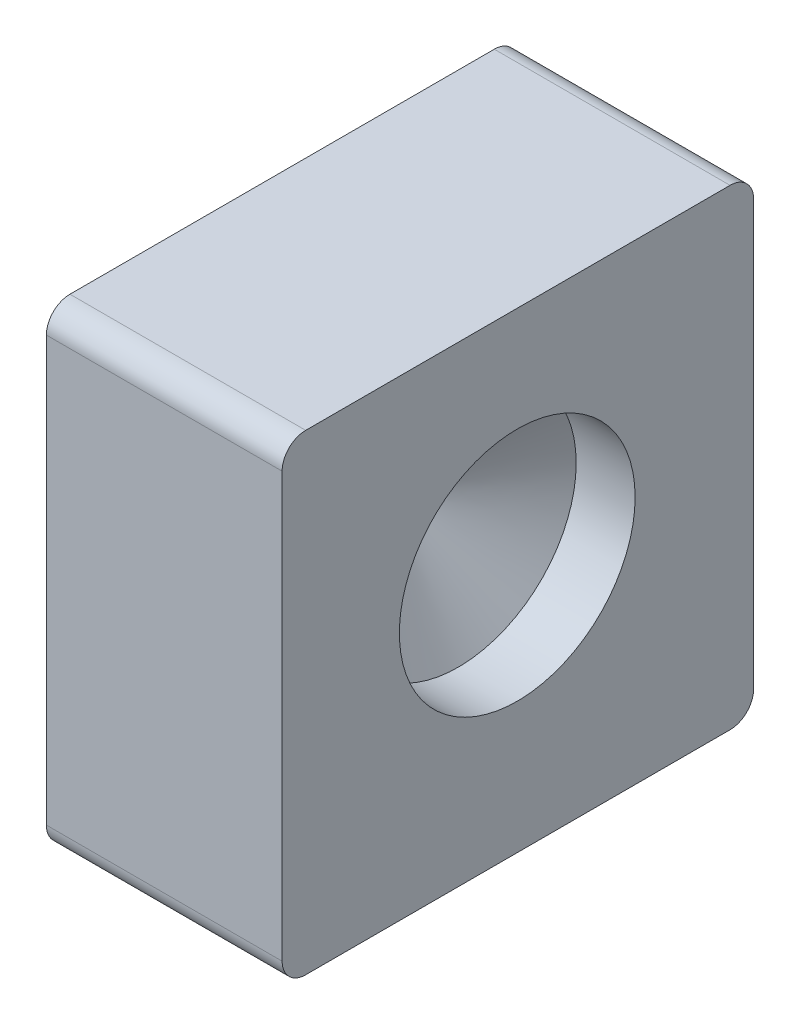
ISO-10303-21;
HEADER;
FILE_DESCRIPTION(('STEP AP214'),'2;1');
FILE_NAME('part.step','',(''),(''),'','','');
FILE_SCHEMA(('AUTOMOTIVE_DESIGN { 1 0 10303 214 1 1 1 1 }'));
ENDSEC;
DATA;
#1=APPLICATION_CONTEXT('core data for automotive mechanical design processes');
#2=APPLICATION_PROTOCOL_DEFINITION('international standard','automotive_design',2000,#1);
#3=PRODUCT_CONTEXT('',#1,'mechanical');
#4=PRODUCT('Part','Part','',(#3));
#5=PRODUCT_RELATED_PRODUCT_CATEGORY('part','',(#4));
#6=PRODUCT_DEFINITION_FORMATION('','',#4);
#7=PRODUCT_DEFINITION_CONTEXT('part definition',#1,'design');
#8=PRODUCT_DEFINITION('design','',#6,#7);
#9=PRODUCT_DEFINITION_SHAPE('','',#8);
#10=(LENGTH_UNIT() NAMED_UNIT(*) SI_UNIT(.MILLI.,.METRE.));
#11=(NAMED_UNIT(*) PLANE_ANGLE_UNIT() SI_UNIT($,.RADIAN.));
#12=(NAMED_UNIT(*) SI_UNIT($,.STERADIAN.) SOLID_ANGLE_UNIT());
#13=UNCERTAINTY_MEASURE_WITH_UNIT(LENGTH_MEASURE(1.E-05),#10,'distance_accuracy_value','');
#14=(GEOMETRIC_REPRESENTATION_CONTEXT(3) GLOBAL_UNCERTAINTY_ASSIGNED_CONTEXT((#13)) GLOBAL_UNIT_ASSIGNED_CONTEXT((#10,
#11,#12)) REPRESENTATION_CONTEXT('',''));
#15=CARTESIAN_POINT('',(0.,0.,0.));
#16=DIRECTION('',(0.,0.,1.));
#17=DIRECTION('',(1.,0.,0.));
#18=AXIS2_PLACEMENT_3D('',#15,#16,#17);
#19=CARTESIAN_POINT('',(25.4,24.2943377133913,25.2010381101445));
#20=DIRECTION('',(-1.,0.,0.));
#21=DIRECTION('',(0.,0.,1.));
#22=AXIS2_PLACEMENT_3D('',#19,#20,#21);
#23=CYLINDRICAL_SURFACE('',#22,2.54);
#24=CARTESIAN_POINT('',(0.,24.2943377133913,25.2010381101445));
#25=DIRECTION('',(1.,0.,0.));
#26=DIRECTION('',(0.,0.,-1.));
#27=AXIS2_PLACEMENT_3D('',#24,#25,#26);
#28=CIRCLE('',#27,2.54);
#29=CARTESIAN_POINT('',(0.,26.8343377133913,25.2010381101445));
#30=VERTEX_POINT('',#29);
#31=CARTESIAN_POINT('',(0.,24.2943377133913,27.7410381101445));
#32=VERTEX_POINT('',#31);
#33=EDGE_CURVE('E146',#30,#32,#28,.T.);
#34=ORIENTED_EDGE('',*,*,#33,.T.);
#35=DIRECTION('',(-1.,0.,0.));
#36=VECTOR('',#35,1.);
#37=CARTESIAN_POINT('',(25.4,24.2943377133913,27.7410381101445));
#38=LINE('',#37,#36);
#39=CARTESIAN_POINT('',(25.4,24.2943377133913,27.7410381101445));
#40=VERTEX_POINT('',#39);
#41=EDGE_CURVE('E11',#40,#32,#38,.T.);
#42=ORIENTED_EDGE('',*,*,#41,.F.);
#43=CARTESIAN_POINT('',(25.4,24.2943377133913,25.2010381101445));
#44=DIRECTION('',(1.,0.,0.));
#45=DIRECTION('',(0.,0.,-1.));
#46=AXIS2_PLACEMENT_3D('',#43,#44,#45);
#47=CIRCLE('',#46,2.54);
#48=CARTESIAN_POINT('',(25.4,26.8343377133913,25.2010381101445));
#49=VERTEX_POINT('',#48);
#50=EDGE_CURVE('E169',#49,#40,#47,.T.);
#51=ORIENTED_EDGE('',*,*,#50,.F.);
#52=DIRECTION('',(-1.,0.,0.));
#53=VECTOR('',#52,1.);
#54=CARTESIAN_POINT('',(25.4,26.8343377133913,25.2010381101445));
#55=LINE('',#54,#53);
#56=EDGE_CURVE('E142',#49,#30,#55,.T.);
#57=ORIENTED_EDGE('',*,*,#56,.T.);
#58=EDGE_LOOP('',(#34,#42,#51,#57));
#59=FACE_BOUND('',#58,.T.);
#60=ADVANCED_FACE('F43',(#59),#23,.T.);
#61=CARTESIAN_POINT('',(25.4,-21.4256622866086,27.7410381101445));
#62=DIRECTION('',(0.,0.,-1.));
#63=DIRECTION('',(0.,1.,0.));
#64=AXIS2_PLACEMENT_3D('',#61,#62,#63);
#65=PLANE('',#64);
#66=DIRECTION('',(0.,-1.,0.));
#67=VECTOR('',#66,1.);
#68=CARTESIAN_POINT('',(0.,-21.4256622866086,27.7410381101445));
#69=LINE('',#68,#67);
#70=CARTESIAN_POINT('',(0.,-21.4256622866087,27.7410381101445));
#71=VERTEX_POINT('',#70);
#72=EDGE_CURVE('E150',#32,#71,#69,.T.);
#73=ORIENTED_EDGE('',*,*,#72,.T.);
#74=DIRECTION('',(-1.,0.,0.));
#75=VECTOR('',#74,1.);
#76=CARTESIAN_POINT('',(25.4,-21.4256622866087,27.7410381101445));
#77=LINE('',#76,#75);
#78=CARTESIAN_POINT('',(25.4,-21.4256622866087,27.7410381101445));
#79=VERTEX_POINT('',#78);
#80=EDGE_CURVE('E52',#79,#71,#77,.T.);
#81=ORIENTED_EDGE('',*,*,#80,.F.);
#82=DIRECTION('',(0.,-1.,0.));
#83=VECTOR('',#82,1.);
#84=CARTESIAN_POINT('',(25.4,-21.4256622866086,27.7410381101445));
#85=LINE('',#84,#83);
#86=EDGE_CURVE('E104',#40,#79,#85,.T.);
#87=ORIENTED_EDGE('',*,*,#86,.F.);
#88=ORIENTED_EDGE('',*,*,#41,.T.);
#89=EDGE_LOOP('',(#73,#81,#87,#88));
#90=FACE_BOUND('',#89,.T.);
#91=ADVANCED_FACE('F235',(#90),#65,.F.);
#92=CARTESIAN_POINT('',(25.4,-21.4256622866087,25.2010381101445));
#93=DIRECTION('',(-1.,0.,0.));
#94=DIRECTION('',(0.,0.,1.));
#95=AXIS2_PLACEMENT_3D('',#92,#93,#94);
#96=CYLINDRICAL_SURFACE('',#95,2.54);
#97=CARTESIAN_POINT('',(0.,-21.4256622866087,25.2010381101445));
#98=DIRECTION('',(1.,0.,0.));
#99=DIRECTION('',(0.,0.,1.));
#100=AXIS2_PLACEMENT_3D('',#97,#98,#99);
#101=CIRCLE('',#100,2.54);
#102=CARTESIAN_POINT('',(0.,-23.9656622866087,25.2010381101445));
#103=VERTEX_POINT('',#102);
#104=EDGE_CURVE('E154',#71,#103,#101,.T.);
#105=ORIENTED_EDGE('',*,*,#104,.T.);
#106=DIRECTION('',(-1.,0.,0.));
#107=VECTOR('',#106,1.);
#108=CARTESIAN_POINT('',(25.4,-23.9656622866087,25.2010381101445));
#109=LINE('',#108,#107);
#110=CARTESIAN_POINT('',(25.4,-23.9656622866087,25.2010381101445));
#111=VERTEX_POINT('',#110);
#112=EDGE_CURVE('E180',#111,#103,#109,.T.);
#113=ORIENTED_EDGE('',*,*,#112,.F.);
#114=CARTESIAN_POINT('',(25.4,-21.4256622866087,25.2010381101445));
#115=DIRECTION('',(1.,0.,0.));
#116=DIRECTION('',(0.,0.,1.));
#117=AXIS2_PLACEMENT_3D('',#114,#115,#116);
#118=CIRCLE('',#117,2.54);
#119=EDGE_CURVE('E190',#79,#111,#118,.T.);
#120=ORIENTED_EDGE('',*,*,#119,.F.);
#121=ORIENTED_EDGE('',*,*,#80,.T.);
#122=EDGE_LOOP('',(#105,#113,#120,#121));
#123=FACE_BOUND('',#122,.T.);
#124=ADVANCED_FACE('F188',(#123),#96,.T.);
#125=CARTESIAN_POINT('',(25.4,-23.9656622866087,-20.5189618898555));
#126=DIRECTION('',(0.,1.,0.));
#127=DIRECTION('',(0.,0.,1.));
#128=AXIS2_PLACEMENT_3D('',#125,#126,#127);
#129=PLANE('',#128);
#130=DIRECTION('',(0.,0.,-1.));
#131=VECTOR('',#130,1.);
#132=CARTESIAN_POINT('',(0.,-23.9656622866087,-20.5189618898555));
#133=LINE('',#132,#131);
#134=CARTESIAN_POINT('',(0.,-23.9656622866087,-20.5189618898555));
#135=VERTEX_POINT('',#134);
#136=EDGE_CURVE('E157',#103,#135,#133,.T.);
#137=ORIENTED_EDGE('',*,*,#136,.T.);
#138=DIRECTION('',(-1.,0.,0.));
#139=VECTOR('',#138,1.);
#140=CARTESIAN_POINT('',(25.4,-23.9656622866087,-20.5189618898555));
#141=LINE('',#140,#139);
#142=CARTESIAN_POINT('',(25.4,-23.9656622866087,-20.5189618898555));
#143=VERTEX_POINT('',#142);
#144=EDGE_CURVE('E176',#143,#135,#141,.T.);
#145=ORIENTED_EDGE('',*,*,#144,.F.);
#146=DIRECTION('',(0.,0.,-1.));
#147=VECTOR('',#146,1.);
#148=CARTESIAN_POINT('',(25.4,-23.9656622866087,-20.5189618898555));
#149=LINE('',#148,#147);
#150=EDGE_CURVE('E203',#111,#143,#149,.T.);
#151=ORIENTED_EDGE('',*,*,#150,.F.);
#152=ORIENTED_EDGE('',*,*,#112,.T.);
#153=EDGE_LOOP('',(#137,#145,#151,#152));
#154=FACE_BOUND('',#153,.T.);
#155=ADVANCED_FACE('F198',(#154),#129,.F.);
#156=CARTESIAN_POINT('',(25.4,-21.4256622866087,-20.5189618898555));
#157=DIRECTION('',(-1.,0.,0.));
#158=DIRECTION('',(0.,0.,1.));
#159=AXIS2_PLACEMENT_3D('',#156,#157,#158);
#160=CYLINDRICAL_SURFACE('',#159,2.54);
#161=CARTESIAN_POINT('',(0.,-21.4256622866087,-20.5189618898555));
#162=DIRECTION('',(1.,0.,0.));
#163=DIRECTION('',(0.,0.,1.));
#164=AXIS2_PLACEMENT_3D('',#161,#162,#163);
#165=CIRCLE('',#164,2.54);
#166=CARTESIAN_POINT('',(0.,-21.4256622866086,-23.0589618898555));
#167=VERTEX_POINT('',#166);
#168=EDGE_CURVE('E160',#135,#167,#165,.T.);
#169=ORIENTED_EDGE('',*,*,#168,.T.);
#170=DIRECTION('',(-1.,0.,0.));
#171=VECTOR('',#170,1.);
#172=CARTESIAN_POINT('',(25.4,-21.4256622866086,-23.0589618898555));
#173=LINE('',#172,#171);
#174=CARTESIAN_POINT('',(25.4,-21.4256622866086,-23.0589618898555));
#175=VERTEX_POINT('',#174);
#176=EDGE_CURVE('E135',#175,#167,#173,.T.);
#177=ORIENTED_EDGE('',*,*,#176,.F.);
#178=CARTESIAN_POINT('',(25.4,-21.4256622866087,-20.5189618898555));
#179=DIRECTION('',(1.,0.,0.));
#180=DIRECTION('',(0.,0.,1.));
#181=AXIS2_PLACEMENT_3D('',#178,#179,#180);
#182=CIRCLE('',#181,2.54);
#183=EDGE_CURVE('E124',#143,#175,#182,.T.);
#184=ORIENTED_EDGE('',*,*,#183,.F.);
#185=ORIENTED_EDGE('',*,*,#144,.T.);
#186=EDGE_LOOP('',(#169,#177,#184,#185));
#187=FACE_BOUND('',#186,.T.);
#188=ADVANCED_FACE('F201',(#187),#160,.T.);
#189=CARTESIAN_POINT('',(25.4,24.2943377133913,-23.0589618898555));
#190=DIRECTION('',(0.,0.,1.));
#191=DIRECTION('',(0.,-1.,0.));
#192=AXIS2_PLACEMENT_3D('',#189,#190,#191);
#193=PLANE('',#192);
#194=DIRECTION('',(0.,1.,0.));
#195=VECTOR('',#194,1.);
#196=CARTESIAN_POINT('',(0.,24.2943377133913,-23.0589618898555));
#197=LINE('',#196,#195);
#198=CARTESIAN_POINT('',(0.,24.2943377133913,-23.0589618898555));
#199=VERTEX_POINT('',#198);
#200=EDGE_CURVE('E133',#167,#199,#197,.T.);
#201=ORIENTED_EDGE('',*,*,#200,.T.);
#202=DIRECTION('',(-1.,0.,0.));
#203=VECTOR('',#202,1.);
#204=CARTESIAN_POINT('',(25.4,24.2943377133913,-23.0589618898555));
#205=LINE('',#204,#203);
#206=CARTESIAN_POINT('',(25.4,24.2943377133913,-23.0589618898555));
#207=VERTEX_POINT('',#206);
#208=EDGE_CURVE('E130',#207,#199,#205,.T.);
#209=ORIENTED_EDGE('',*,*,#208,.F.);
#210=DIRECTION('',(0.,1.,0.));
#211=VECTOR('',#210,1.);
#212=CARTESIAN_POINT('',(25.4,24.2943377133913,-23.0589618898555));
#213=LINE('',#212,#211);
#214=EDGE_CURVE('E118',#175,#207,#213,.T.);
#215=ORIENTED_EDGE('',*,*,#214,.F.);
#216=ORIENTED_EDGE('',*,*,#176,.T.);
#217=EDGE_LOOP('',(#201,#209,#215,#216));
#218=FACE_BOUND('',#217,.T.);
#219=ADVANCED_FACE('F131',(#218),#193,.F.);
#220=CARTESIAN_POINT('',(25.4,24.2943377133913,-20.5189618898555));
#221=DIRECTION('',(-1.,0.,0.));
#222=DIRECTION('',(0.,0.,1.));
#223=AXIS2_PLACEMENT_3D('',#220,#221,#222);
#224=CYLINDRICAL_SURFACE('',#223,2.54);
#225=CARTESIAN_POINT('',(0.,24.2943377133913,-20.5189618898555));
#226=DIRECTION('',(1.,0.,0.));
#227=DIRECTION('',(0.,0.,1.));
#228=AXIS2_PLACEMENT_3D('',#225,#226,#227);
#229=CIRCLE('',#228,2.54);
#230=CARTESIAN_POINT('',(0.,26.8343377133913,-20.5189618898555));
#231=VERTEX_POINT('',#230);
#232=EDGE_CURVE('E90',#199,#231,#229,.T.);
#233=ORIENTED_EDGE('',*,*,#232,.T.);
#234=DIRECTION('',(-1.,0.,0.));
#235=VECTOR('',#234,1.);
#236=CARTESIAN_POINT('',(25.4,26.8343377133913,-20.5189618898555));
#237=LINE('',#236,#235);
#238=CARTESIAN_POINT('',(25.4,26.8343377133913,-20.5189618898555));
#239=VERTEX_POINT('',#238);
#240=EDGE_CURVE('E136',#239,#231,#237,.T.);
#241=ORIENTED_EDGE('',*,*,#240,.F.);
#242=CARTESIAN_POINT('',(25.4,24.2943377133913,-20.5189618898555));
#243=DIRECTION('',(1.,0.,0.));
#244=DIRECTION('',(0.,0.,1.));
#245=AXIS2_PLACEMENT_3D('',#242,#243,#244);
#246=CIRCLE('',#245,2.54);
#247=EDGE_CURVE('E122',#207,#239,#246,.T.);
#248=ORIENTED_EDGE('',*,*,#247,.F.);
#249=ORIENTED_EDGE('',*,*,#208,.T.);
#250=EDGE_LOOP('',(#233,#241,#248,#249));
#251=FACE_BOUND('',#250,.T.);
#252=ADVANCED_FACE('F138',(#251),#224,.T.);
#253=CARTESIAN_POINT('',(25.4,26.8343377133913,25.2010381101445));
#254=DIRECTION('',(0.,-1.,0.));
#255=DIRECTION('',(0.,0.,-1.));
#256=AXIS2_PLACEMENT_3D('',#253,#254,#255);
#257=PLANE('',#256);
#258=DIRECTION('',(0.,0.,1.));
#259=VECTOR('',#258,1.);
#260=CARTESIAN_POINT('',(0.,26.8343377133913,25.2010381101445));
#261=LINE('',#260,#259);
#262=EDGE_CURVE('E96',#231,#30,#261,.T.);
#263=ORIENTED_EDGE('',*,*,#262,.T.);
#264=ORIENTED_EDGE('',*,*,#56,.F.);
#265=DIRECTION('',(0.,0.,1.));
#266=VECTOR('',#265,1.);
#267=CARTESIAN_POINT('',(25.4,26.8343377133913,25.2010381101445));
#268=LINE('',#267,#266);
#269=EDGE_CURVE('E60',#239,#49,#268,.T.);
#270=ORIENTED_EDGE('',*,*,#269,.F.);
#271=ORIENTED_EDGE('',*,*,#240,.T.);
#272=EDGE_LOOP('',(#263,#264,#270,#271));
#273=FACE_BOUND('',#272,.T.);
#274=ADVANCED_FACE('F224',(#273),#257,.F.);
#275=CARTESIAN_POINT('',(25.4,24.2943377133913,25.2010381101445));
#276=DIRECTION('',(1.,0.,0.));
#277=DIRECTION('',(0.,0.,-1.));
#278=AXIS2_PLACEMENT_3D('',#275,#276,#277);
#279=PLANE('',#278);
#280=CARTESIAN_POINT('',(25.4,2.86229424926163,2.40903604042401));
#281=DIRECTION('',(1.,0.,0.));
#282=DIRECTION('',(0.,0.,-1.));
#283=AXIS2_PLACEMENT_3D('',#280,#281,#282);
#284=CIRCLE('',#283,12.7);
#285=CARTESIAN_POINT('',(25.4,2.86229424926163,-10.290963959576));
#286=VERTEX_POINT('',#285);
#287=EDGE_CURVE('E216',#286,#286,#284,.T.);
#288=ORIENTED_EDGE('',*,*,#287,.F.);
#289=EDGE_LOOP('',(#288));
#290=FACE_BOUND('',#289,.T.);
#291=ORIENTED_EDGE('',*,*,#50,.T.);
#292=ORIENTED_EDGE('',*,*,#86,.T.);
#293=ORIENTED_EDGE('',*,*,#119,.T.);
#294=ORIENTED_EDGE('',*,*,#150,.T.);
#295=ORIENTED_EDGE('',*,*,#183,.T.);
#296=ORIENTED_EDGE('',*,*,#214,.T.);
#297=ORIENTED_EDGE('',*,*,#247,.T.);
#298=ORIENTED_EDGE('',*,*,#269,.T.);
#299=EDGE_LOOP('',(#291,#292,#293,#294,#295,#296,#297,#298));
#300=FACE_BOUND('',#299,.T.);
#301=ADVANCED_FACE('F120',(#290,#300),#279,.T.);
#302=CARTESIAN_POINT('',(0.,24.2943377133913,25.2010381101445));
#303=DIRECTION('',(1.,0.,0.));
#304=DIRECTION('',(0.,0.,-1.));
#305=AXIS2_PLACEMENT_3D('',#302,#303,#304);
#306=PLANE('',#305);
#307=ORIENTED_EDGE('',*,*,#33,.F.);
#308=ORIENTED_EDGE('',*,*,#262,.F.);
#309=ORIENTED_EDGE('',*,*,#232,.F.);
#310=ORIENTED_EDGE('',*,*,#200,.F.);
#311=ORIENTED_EDGE('',*,*,#168,.F.);
#312=ORIENTED_EDGE('',*,*,#136,.F.);
#313=ORIENTED_EDGE('',*,*,#104,.F.);
#314=ORIENTED_EDGE('',*,*,#72,.F.);
#315=EDGE_LOOP('',(#307,#308,#309,#310,#311,#312,#313,#314));
#316=FACE_BOUND('',#315,.T.);
#317=ADVANCED_FACE('F194',(#316),#306,.F.);
#318=CARTESIAN_POINT('',(19.05,2.86229424926163,2.40903604042401));
#319=DIRECTION('',(1.,0.,0.));
#320=DIRECTION('',(0.,0.,-1.));
#321=AXIS2_PLACEMENT_3D('',#318,#319,#320);
#322=CONICAL_SURFACE('',#321,12.7,1.02974425867665);
#323=CARTESIAN_POINT('',(11.41907013835,2.86229424926163,2.40903604042401));
#324=VERTEX_POINT('',#323);
#325=VERTEX_LOOP('',#324);
#326=FACE_BOUND('',#325,.T.);
#327=CARTESIAN_POINT('',(19.05,2.86229424926163,2.40903604042401));
#328=DIRECTION('',(1.,0.,0.));
#329=DIRECTION('',(0.,0.,-1.));
#330=AXIS2_PLACEMENT_3D('',#327,#328,#329);
#331=CIRCLE('',#330,12.7);
#332=CARTESIAN_POINT('',(19.05,2.86229424926163,-10.290963959576));
#333=VERTEX_POINT('',#332);
#334=EDGE_CURVE('E151',#333,#333,#331,.T.);
#335=ORIENTED_EDGE('',*,*,#334,.T.);
#336=EDGE_LOOP('',(#335));
#337=FACE_BOUND('',#336,.T.);
#338=ADVANCED_FACE('F230',(#326,#337),#322,.F.);
#339=CARTESIAN_POINT('',(25.4,2.86229424926163,2.40903604042401));
#340=DIRECTION('',(1.,0.,0.));
#341=DIRECTION('',(0.,0.,-1.));
#342=AXIS2_PLACEMENT_3D('',#339,#340,#341);
#343=CYLINDRICAL_SURFACE('',#342,12.7);
#344=ORIENTED_EDGE('',*,*,#334,.F.);
#345=EDGE_LOOP('',(#344));
#346=FACE_BOUND('',#345,.T.);
#347=ORIENTED_EDGE('',*,*,#287,.T.);
#348=EDGE_LOOP('',(#347));
#349=FACE_BOUND('',#348,.T.);
#350=ADVANCED_FACE('F221',(#346,#349),#343,.F.);
#351=CLOSED_SHELL('',(#60,#91,#124,#155,#188,#219,#252,#274,#301,#317,#338,#350));
#352=MANIFOLD_SOLID_BREP('B2',#351);
#353=ADVANCED_BREP_SHAPE_REPRESENTATION('',(#18,#352),#14);
#354=SHAPE_DEFINITION_REPRESENTATION(#9,#353);
ENDSEC;
END-ISO-10303-21;
